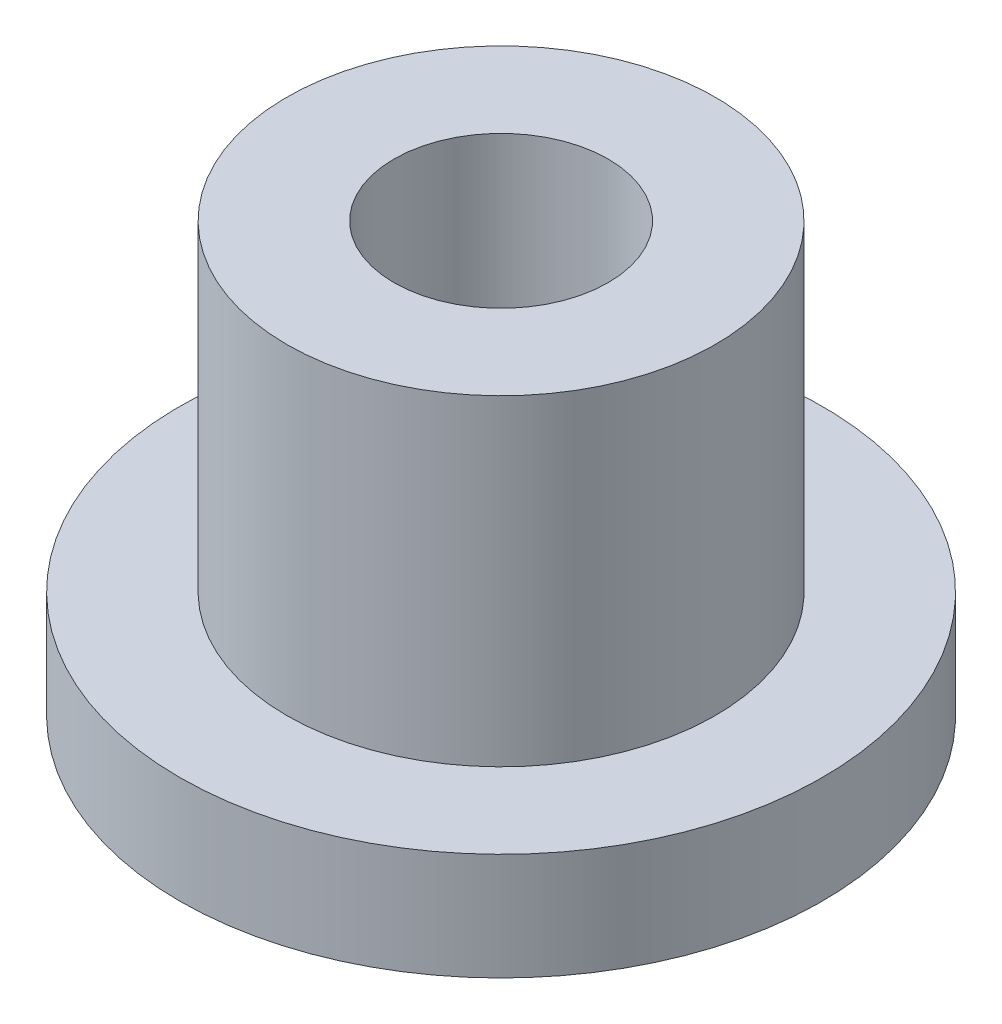
ISO-10303-21;
HEADER;
FILE_DESCRIPTION(('STEP AP214'),'2;1');
FILE_NAME('part.step','',(''),(''),'','','');
FILE_SCHEMA(('AUTOMOTIVE_DESIGN { 1 0 10303 214 1 1 1 1 }'));
ENDSEC;
DATA;
#1=APPLICATION_CONTEXT('core data for automotive mechanical design processes');
#2=APPLICATION_PROTOCOL_DEFINITION('international standard','automotive_design',2000,#1);
#3=PRODUCT_CONTEXT('',#1,'mechanical');
#4=PRODUCT('Part','Part','',(#3));
#5=PRODUCT_RELATED_PRODUCT_CATEGORY('part','',(#4));
#6=PRODUCT_DEFINITION_FORMATION('','',#4);
#7=PRODUCT_DEFINITION_CONTEXT('part definition',#1,'design');
#8=PRODUCT_DEFINITION('design','',#6,#7);
#9=PRODUCT_DEFINITION_SHAPE('','',#8);
#10=(LENGTH_UNIT() NAMED_UNIT(*) SI_UNIT(.MILLI.,.METRE.));
#11=(NAMED_UNIT(*) PLANE_ANGLE_UNIT() SI_UNIT($,.RADIAN.));
#12=(NAMED_UNIT(*) SI_UNIT($,.STERADIAN.) SOLID_ANGLE_UNIT());
#13=UNCERTAINTY_MEASURE_WITH_UNIT(LENGTH_MEASURE(1.E-05),#10,'distance_accuracy_value','');
#14=(GEOMETRIC_REPRESENTATION_CONTEXT(3) GLOBAL_UNCERTAINTY_ASSIGNED_CONTEXT((#13)) GLOBAL_UNIT_ASSIGNED_CONTEXT((#10,
#11,#12)) REPRESENTATION_CONTEXT('',''));
#15=CARTESIAN_POINT('',(0.,0.,0.));
#16=DIRECTION('',(0.,0.,1.));
#17=DIRECTION('',(1.,0.,0.));
#18=AXIS2_PLACEMENT_3D('',#15,#16,#17);
#19=CARTESIAN_POINT('',(0.,2.,0.));
#20=DIRECTION('',(0.,-1.,0.));
#21=DIRECTION('',(0.,0.,-1.));
#22=AXIS2_PLACEMENT_3D('',#19,#20,#21);
#23=CYLINDRICAL_SURFACE('',#22,6.);
#24=CARTESIAN_POINT('',(0.,2.,0.));
#25=DIRECTION('',(0.,1.,0.));
#26=DIRECTION('',(0.,0.,1.));
#27=AXIS2_PLACEMENT_3D('',#24,#25,#26);
#28=CIRCLE('',#27,6.);
#29=CARTESIAN_POINT('',(0.,2.,6.));
#30=VERTEX_POINT('',#29);
#31=EDGE_CURVE('E10',#30,#30,#28,.T.);
#32=ORIENTED_EDGE('',*,*,#31,.F.);
#33=EDGE_LOOP('',(#32));
#34=FACE_BOUND('',#33,.T.);
#35=CARTESIAN_POINT('',(0.,0.,0.));
#36=DIRECTION('',(0.,1.,0.));
#37=DIRECTION('',(0.,0.,1.));
#38=AXIS2_PLACEMENT_3D('',#35,#36,#37);
#39=CIRCLE('',#38,6.);
#40=CARTESIAN_POINT('',(0.,0.,6.));
#41=VERTEX_POINT('',#40);
#42=EDGE_CURVE('E40',#41,#41,#39,.T.);
#43=ORIENTED_EDGE('',*,*,#42,.T.);
#44=EDGE_LOOP('',(#43));
#45=FACE_BOUND('',#44,.T.);
#46=ADVANCED_FACE('F37',(#34,#45),#23,.T.);
#47=CARTESIAN_POINT('',(0.,2.,0.));
#48=DIRECTION('',(0.,1.,0.));
#49=DIRECTION('',(0.,0.,1.));
#50=AXIS2_PLACEMENT_3D('',#47,#48,#49);
#51=PLANE('',#50);
#52=CARTESIAN_POINT('',(0.,2.,0.));
#53=DIRECTION('',(0.,1.,0.));
#54=DIRECTION('',(0.,0.,1.));
#55=AXIS2_PLACEMENT_3D('',#52,#53,#54);
#56=CIRCLE('',#55,4.);
#57=CARTESIAN_POINT('',(0.,2.,4.));
#58=VERTEX_POINT('',#57);
#59=EDGE_CURVE('E44',#58,#58,#56,.T.);
#60=ORIENTED_EDGE('',*,*,#59,.F.);
#61=EDGE_LOOP('',(#60));
#62=FACE_BOUND('',#61,.T.);
#63=ORIENTED_EDGE('',*,*,#31,.T.);
#64=EDGE_LOOP('',(#63));
#65=FACE_BOUND('',#64,.T.);
#66=ADVANCED_FACE('F79',(#62,#65),#51,.T.);
#67=CARTESIAN_POINT('',(0.,0.,0.));
#68=DIRECTION('',(0.,1.,0.));
#69=DIRECTION('',(0.,0.,1.));
#70=AXIS2_PLACEMENT_3D('',#67,#68,#69);
#71=PLANE('',#70);
#72=ORIENTED_EDGE('',*,*,#42,.F.);
#73=EDGE_LOOP('',(#72));
#74=FACE_BOUND('',#73,.T.);
#75=CARTESIAN_POINT('',(0.,0.,0.));
#76=DIRECTION('',(0.,1.,0.));
#77=DIRECTION('',(0.,0.,1.));
#78=AXIS2_PLACEMENT_3D('',#75,#76,#77);
#79=CIRCLE('',#78,2.);
#80=CARTESIAN_POINT('',(0.,0.,2.));
#81=VERTEX_POINT('',#80);
#82=EDGE_CURVE('E50',#81,#81,#79,.T.);
#83=ORIENTED_EDGE('',*,*,#82,.T.);
#84=EDGE_LOOP('',(#83));
#85=FACE_BOUND('',#84,.T.);
#86=ADVANCED_FACE('F76',(#74,#85),#71,.F.);
#87=CARTESIAN_POINT('',(0.,8.,0.));
#88=DIRECTION('',(0.,-1.,0.));
#89=DIRECTION('',(0.,0.,-1.));
#90=AXIS2_PLACEMENT_3D('',#87,#88,#89);
#91=CYLINDRICAL_SURFACE('',#90,2.);
#92=CARTESIAN_POINT('',(0.,8.,0.));
#93=DIRECTION('',(0.,1.,0.));
#94=DIRECTION('',(0.,0.,1.));
#95=AXIS2_PLACEMENT_3D('',#92,#93,#94);
#96=CIRCLE('',#95,2.);
#97=CARTESIAN_POINT('',(0.,8.,2.));
#98=VERTEX_POINT('',#97);
#99=EDGE_CURVE('E53',#98,#98,#96,.T.);
#100=ORIENTED_EDGE('',*,*,#99,.T.);
#101=EDGE_LOOP('',(#100));
#102=FACE_BOUND('',#101,.T.);
#103=ORIENTED_EDGE('',*,*,#82,.F.);
#104=EDGE_LOOP('',(#103));
#105=FACE_BOUND('',#104,.T.);
#106=ADVANCED_FACE('F60',(#102,#105),#91,.F.);
#107=CARTESIAN_POINT('',(0.,8.,0.));
#108=DIRECTION('',(0.,-1.,0.));
#109=DIRECTION('',(0.,0.,-1.));
#110=AXIS2_PLACEMENT_3D('',#107,#108,#109);
#111=CYLINDRICAL_SURFACE('',#110,4.);
#112=ORIENTED_EDGE('',*,*,#59,.T.);
#113=EDGE_LOOP('',(#112));
#114=FACE_BOUND('',#113,.T.);
#115=CARTESIAN_POINT('',(0.,8.,0.));
#116=DIRECTION('',(0.,1.,0.));
#117=DIRECTION('',(0.,0.,1.));
#118=AXIS2_PLACEMENT_3D('',#115,#116,#117);
#119=CIRCLE('',#118,4.);
#120=CARTESIAN_POINT('',(0.,8.,4.));
#121=VERTEX_POINT('',#120);
#122=EDGE_CURVE('E54',#121,#121,#119,.T.);
#123=ORIENTED_EDGE('',*,*,#122,.F.);
#124=EDGE_LOOP('',(#123));
#125=FACE_BOUND('',#124,.T.);
#126=ADVANCED_FACE('F66',(#114,#125),#111,.T.);
#127=CARTESIAN_POINT('',(0.,8.,0.));
#128=DIRECTION('',(0.,1.,0.));
#129=DIRECTION('',(0.,0.,1.));
#130=AXIS2_PLACEMENT_3D('',#127,#128,#129);
#131=PLANE('',#130);
#132=ORIENTED_EDGE('',*,*,#99,.F.);
#133=EDGE_LOOP('',(#132));
#134=FACE_BOUND('',#133,.T.);
#135=ORIENTED_EDGE('',*,*,#122,.T.);
#136=EDGE_LOOP('',(#135));
#137=FACE_BOUND('',#136,.T.);
#138=ADVANCED_FACE('F63',(#134,#137),#131,.T.);
#139=CLOSED_SHELL('',(#46,#66,#86,#106,#126,#138));
#140=MANIFOLD_SOLID_BREP('B2',#139);
#141=ADVANCED_BREP_SHAPE_REPRESENTATION('',(#18,#140),#14);
#142=SHAPE_DEFINITION_REPRESENTATION(#9,#141);
ENDSEC;
END-ISO-10303-21;
